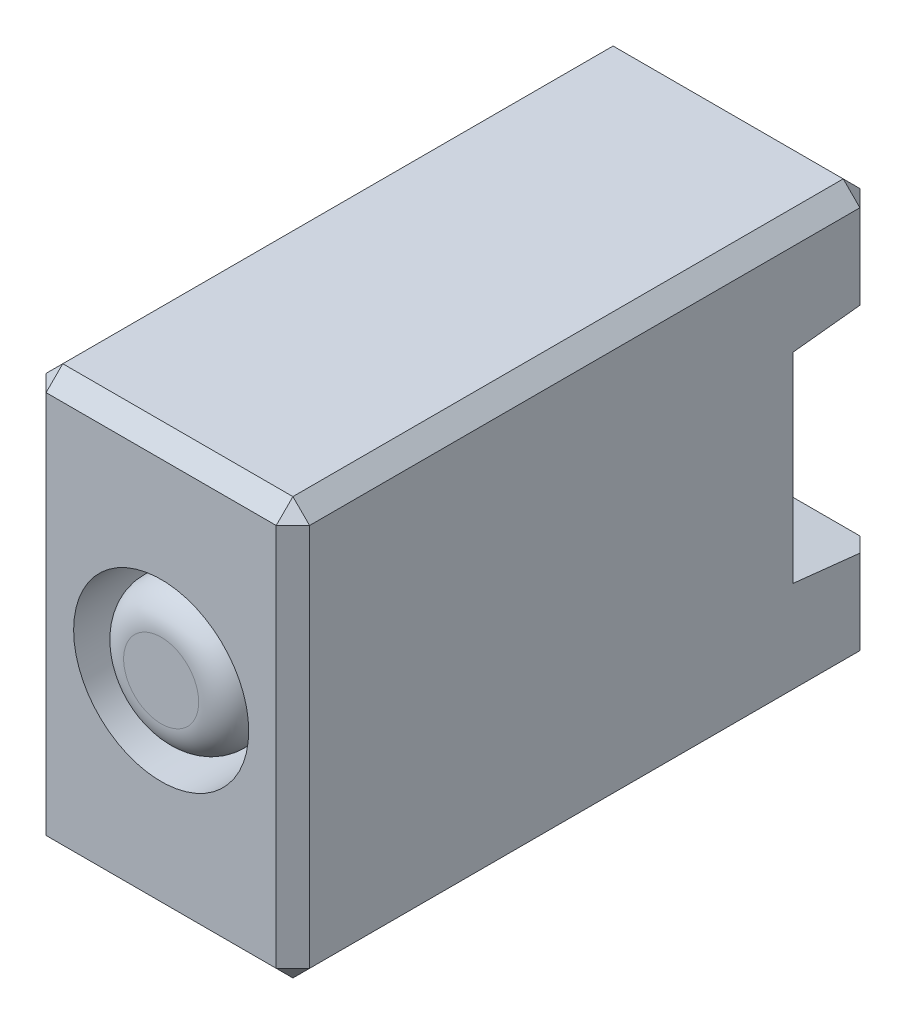
ISO-10303-21;
HEADER;
FILE_DESCRIPTION(('STEP AP214'),'2;1');
FILE_NAME('part.step','',(''),(''),'','','');
FILE_SCHEMA(('AUTOMOTIVE_DESIGN { 1 0 10303 214 1 1 1 1 }'));
ENDSEC;
DATA;
#1=APPLICATION_CONTEXT('core data for automotive mechanical design processes');
#2=APPLICATION_PROTOCOL_DEFINITION('international standard','automotive_design',2000,#1);
#3=PRODUCT_CONTEXT('',#1,'mechanical');
#4=PRODUCT('Part','Part','',(#3));
#5=PRODUCT_RELATED_PRODUCT_CATEGORY('part','',(#4));
#6=PRODUCT_DEFINITION_FORMATION('','',#4);
#7=PRODUCT_DEFINITION_CONTEXT('part definition',#1,'design');
#8=PRODUCT_DEFINITION('design','',#6,#7);
#9=PRODUCT_DEFINITION_SHAPE('','',#8);
#10=(LENGTH_UNIT() NAMED_UNIT(*) SI_UNIT(.MILLI.,.METRE.));
#11=(NAMED_UNIT(*) PLANE_ANGLE_UNIT() SI_UNIT($,.RADIAN.));
#12=(NAMED_UNIT(*) SI_UNIT($,.STERADIAN.) SOLID_ANGLE_UNIT());
#13=UNCERTAINTY_MEASURE_WITH_UNIT(LENGTH_MEASURE(1.E-05),#10,'distance_accuracy_value','');
#14=(GEOMETRIC_REPRESENTATION_CONTEXT(3) GLOBAL_UNCERTAINTY_ASSIGNED_CONTEXT((#13)) GLOBAL_UNIT_ASSIGNED_CONTEXT((#10,
#11,#12)) REPRESENTATION_CONTEXT('',''));
#15=CARTESIAN_POINT('',(0.,0.,0.));
#16=DIRECTION('',(0.,0.,1.));
#17=DIRECTION('',(1.,0.,0.));
#18=AXIS2_PLACEMENT_3D('',#15,#16,#17);
#19=CARTESIAN_POINT('',(7.9,12.5,35.));
#20=DIRECTION('',(-1.,0.,0.));
#21=DIRECTION('',(0.,-1.,0.));
#22=AXIS2_PLACEMENT_3D('',#19,#20,#21);
#23=PLANE('',#22);
#24=DIRECTION('',(0.,-0.107088709712631,0.994249469827409));
#25=VECTOR('',#24,1.);
#26=CARTESIAN_POINT('',(7.9,6.77001120157258,-2.10907498741003));
#27=LINE('',#26,#25);
#28=CARTESIAN_POINT('',(7.9,6.43513867822152,1.00000000000001));
#29=VERTEX_POINT('',#28);
#30=CARTESIAN_POINT('',(7.9,6.00430632492403,5.));
#31=VERTEX_POINT('',#30);
#32=EDGE_CURVE('E161',#29,#31,#27,.T.);
#33=ORIENTED_EDGE('',*,*,#32,.F.);
#34=DIRECTION('',(0.,1.,0.));
#35=VECTOR('',#34,1.);
#36=CARTESIAN_POINT('',(7.9,12.5,1.));
#37=LINE('',#36,#35);
#38=CARTESIAN_POINT('',(7.9,11.5,1.));
#39=VERTEX_POINT('',#38);
#40=EDGE_CURVE('E225',#29,#39,#37,.T.);
#41=ORIENTED_EDGE('',*,*,#40,.T.);
#42=DIRECTION('',(0.,0.,1.));
#43=VECTOR('',#42,1.);
#44=CARTESIAN_POINT('',(7.9,11.5,35.));
#45=LINE('',#44,#43);
#46=CARTESIAN_POINT('',(7.9,11.5,34.));
#47=VERTEX_POINT('',#46);
#48=EDGE_CURVE('E221',#39,#47,#45,.T.);
#49=ORIENTED_EDGE('',*,*,#48,.T.);
#50=DIRECTION('',(0.,-1.,0.));
#51=VECTOR('',#50,1.);
#52=CARTESIAN_POINT('',(7.9,-12.5,34.));
#53=LINE('',#52,#51);
#54=CARTESIAN_POINT('',(7.9,-11.5,34.));
#55=VERTEX_POINT('',#54);
#56=EDGE_CURVE('E219',#47,#55,#53,.T.);
#57=ORIENTED_EDGE('',*,*,#56,.T.);
#58=DIRECTION('',(0.,0.,-1.));
#59=VECTOR('',#58,1.);
#60=CARTESIAN_POINT('',(7.9,-11.5,35.));
#61=LINE('',#60,#59);
#62=CARTESIAN_POINT('',(7.9,-11.5,1.));
#63=VERTEX_POINT('',#62);
#64=EDGE_CURVE('E217',#55,#63,#61,.T.);
#65=ORIENTED_EDGE('',*,*,#64,.T.);
#66=DIRECTION('',(0.,1.,0.));
#67=VECTOR('',#66,1.);
#68=CARTESIAN_POINT('',(7.9,12.5,1.));
#69=LINE('',#68,#67);
#70=CARTESIAN_POINT('',(7.9,-6.43513867822152,0.999999999999997));
#71=VERTEX_POINT('',#70);
#72=EDGE_CURVE('E223',#63,#71,#69,.T.);
#73=ORIENTED_EDGE('',*,*,#72,.T.);
#74=DIRECTION('',(0.,0.107088709712631,0.994249469827409));
#75=VECTOR('',#74,1.);
#76=CARTESIAN_POINT('',(7.9,-6.77001120157258,-2.10907498741003));
#77=LINE('',#76,#75);
#78=CARTESIAN_POINT('',(7.9,-6.00430632492403,5.));
#79=VERTEX_POINT('',#78);
#80=EDGE_CURVE('E186',#71,#79,#77,.T.);
#81=ORIENTED_EDGE('',*,*,#80,.T.);
#82=DIRECTION('',(0.,-1.,0.));
#83=VECTOR('',#82,1.);
#84=CARTESIAN_POINT('',(7.9,6.00430632492403,5.));
#85=LINE('',#84,#83);
#86=EDGE_CURVE('E174',#31,#79,#85,.T.);
#87=ORIENTED_EDGE('',*,*,#86,.F.);
#88=EDGE_LOOP('',(#33,#41,#49,#57,#65,#73,#81,#87));
#89=FACE_BOUND('',#88,.T.);
#90=ADVANCED_FACE('F33',(#89),#23,.F.);
#91=CARTESIAN_POINT('',(-7.9,12.5,35.));
#92=DIRECTION('',(1.,0.,0.));
#93=DIRECTION('',(0.,1.,0.));
#94=AXIS2_PLACEMENT_3D('',#91,#92,#93);
#95=PLANE('',#94);
#96=DIRECTION('',(0.,0.,-1.));
#97=VECTOR('',#96,1.);
#98=CARTESIAN_POINT('',(-7.9,11.5,35.));
#99=LINE('',#98,#97);
#100=CARTESIAN_POINT('',(-7.9,11.5,34.));
#101=VERTEX_POINT('',#100);
#102=CARTESIAN_POINT('',(-7.9,11.5,1.));
#103=VERTEX_POINT('',#102);
#104=EDGE_CURVE('E242',#101,#103,#99,.T.);
#105=ORIENTED_EDGE('',*,*,#104,.T.);
#106=DIRECTION('',(0.,-1.,0.));
#107=VECTOR('',#106,1.);
#108=CARTESIAN_POINT('',(-7.9,12.5,1.));
#109=LINE('',#108,#107);
#110=CARTESIAN_POINT('',(-7.9,6.43513867822152,1.));
#111=VERTEX_POINT('',#110);
#112=EDGE_CURVE('E244',#103,#111,#109,.T.);
#113=ORIENTED_EDGE('',*,*,#112,.T.);
#114=DIRECTION('',(0.,-0.107088709712631,0.994249469827409));
#115=VECTOR('',#114,1.);
#116=CARTESIAN_POINT('',(-7.9,6.77001120157258,-2.10907498741003));
#117=LINE('',#116,#115);
#118=CARTESIAN_POINT('',(-7.9,6.00430632492403,5.));
#119=VERTEX_POINT('',#118);
#120=EDGE_CURVE('E189',#111,#119,#117,.T.);
#121=ORIENTED_EDGE('',*,*,#120,.T.);
#122=DIRECTION('',(0.,-1.,0.));
#123=VECTOR('',#122,1.);
#124=CARTESIAN_POINT('',(-7.9,6.00430632492403,5.));
#125=LINE('',#124,#123);
#126=CARTESIAN_POINT('',(-7.9,-6.00430632492403,5.));
#127=VERTEX_POINT('',#126);
#128=EDGE_CURVE('E181',#119,#127,#125,.T.);
#129=ORIENTED_EDGE('',*,*,#128,.T.);
#130=DIRECTION('',(0.,0.107088709712631,0.994249469827409));
#131=VECTOR('',#130,1.);
#132=CARTESIAN_POINT('',(-7.9,-6.77001120157258,-2.10907498741003));
#133=LINE('',#132,#131);
#134=CARTESIAN_POINT('',(-7.9,-6.43513867822152,1.));
#135=VERTEX_POINT('',#134);
#136=EDGE_CURVE('E183',#135,#127,#133,.T.);
#137=ORIENTED_EDGE('',*,*,#136,.F.);
#138=DIRECTION('',(0.,-1.,0.));
#139=VECTOR('',#138,1.);
#140=CARTESIAN_POINT('',(-7.9,12.5,1.));
#141=LINE('',#140,#139);
#142=CARTESIAN_POINT('',(-7.9,-11.5,1.));
#143=VERTEX_POINT('',#142);
#144=EDGE_CURVE('E240',#135,#143,#141,.T.);
#145=ORIENTED_EDGE('',*,*,#144,.T.);
#146=DIRECTION('',(0.,0.,1.));
#147=VECTOR('',#146,1.);
#148=CARTESIAN_POINT('',(-7.9,-11.5,35.));
#149=LINE('',#148,#147);
#150=CARTESIAN_POINT('',(-7.9,-11.5,34.));
#151=VERTEX_POINT('',#150);
#152=EDGE_CURVE('E236',#143,#151,#149,.T.);
#153=ORIENTED_EDGE('',*,*,#152,.T.);
#154=DIRECTION('',(0.,1.,0.));
#155=VECTOR('',#154,1.);
#156=CARTESIAN_POINT('',(-7.9,12.5,34.));
#157=LINE('',#156,#155);
#158=EDGE_CURVE('E238',#151,#101,#157,.T.);
#159=ORIENTED_EDGE('',*,*,#158,.T.);
#160=EDGE_LOOP('',(#105,#113,#121,#129,#137,#145,#153,#159));
#161=FACE_BOUND('',#160,.T.);
#162=ADVANCED_FACE('F382',(#161),#95,.F.);
#163=CARTESIAN_POINT('',(0.,0.,0.));
#164=DIRECTION('',(0.,0.,1.));
#165=DIRECTION('',(1.,0.,0.));
#166=AXIS2_PLACEMENT_3D('',#163,#164,#165);
#167=PLANE('',#166);
#168=DIRECTION('',(-1.,0.,0.));
#169=VECTOR('',#168,1.);
#170=CARTESIAN_POINT('',(0.,-6.5428467665459,0.));
#171=LINE('',#170,#169);
#172=CARTESIAN_POINT('',(6.89999999999999,-6.5428467665459,0.));
#173=VERTEX_POINT('',#172);
#174=CARTESIAN_POINT('',(-6.89999999999999,-6.5428467665459,0.));
#175=VERTEX_POINT('',#174);
#176=EDGE_CURVE('E208',#173,#175,#171,.T.);
#177=ORIENTED_EDGE('',*,*,#176,.F.);
#178=DIRECTION('',(0.,-1.,0.));
#179=VECTOR('',#178,1.);
#180=CARTESIAN_POINT('',(6.89999999999999,0.,0.));
#181=LINE('',#180,#179);
#182=CARTESIAN_POINT('',(6.9,-11.5,0.));
#183=VERTEX_POINT('',#182);
#184=EDGE_CURVE('E254',#173,#183,#181,.T.);
#185=ORIENTED_EDGE('',*,*,#184,.T.);
#186=DIRECTION('',(-1.,0.,0.));
#187=VECTOR('',#186,1.);
#188=CARTESIAN_POINT('',(0.,-11.5,0.));
#189=LINE('',#188,#187);
#190=CARTESIAN_POINT('',(-6.89999999999999,-11.5,0.));
#191=VERTEX_POINT('',#190);
#192=EDGE_CURVE('E250',#183,#191,#189,.T.);
#193=ORIENTED_EDGE('',*,*,#192,.T.);
#194=DIRECTION('',(0.,1.,0.));
#195=VECTOR('',#194,1.);
#196=CARTESIAN_POINT('',(-6.89999999999999,0.,0.));
#197=LINE('',#196,#195);
#198=EDGE_CURVE('E252',#191,#175,#197,.T.);
#199=ORIENTED_EDGE('',*,*,#198,.T.);
#200=EDGE_LOOP('',(#177,#185,#193,#199));
#201=FACE_BOUND('',#200,.T.);
#202=ADVANCED_FACE('F357',(#201),#167,.F.);
#203=CARTESIAN_POINT('',(-7.9,12.5,35.));
#204=DIRECTION('',(0.,-1.,0.));
#205=DIRECTION('',(0.,0.,-1.));
#206=AXIS2_PLACEMENT_3D('',#203,#204,#205);
#207=PLANE('',#206);
#208=DIRECTION('',(1.,0.,0.));
#209=VECTOR('',#208,1.);
#210=CARTESIAN_POINT('',(7.9,12.5,34.));
#211=LINE('',#210,#209);
#212=CARTESIAN_POINT('',(-6.9,12.5,34.));
#213=VERTEX_POINT('',#212);
#214=CARTESIAN_POINT('',(6.9,12.5,34.));
#215=VERTEX_POINT('',#214);
#216=EDGE_CURVE('E265',#213,#215,#211,.T.);
#217=ORIENTED_EDGE('',*,*,#216,.T.);
#218=DIRECTION('',(0.,0.,-1.));
#219=VECTOR('',#218,1.);
#220=CARTESIAN_POINT('',(6.9,12.5,35.));
#221=LINE('',#220,#219);
#222=CARTESIAN_POINT('',(6.9,12.5,1.));
#223=VERTEX_POINT('',#222);
#224=EDGE_CURVE('E271',#215,#223,#221,.T.);
#225=ORIENTED_EDGE('',*,*,#224,.T.);
#226=DIRECTION('',(-1.,0.,0.));
#227=VECTOR('',#226,1.);
#228=CARTESIAN_POINT('',(-7.9,12.5,1.));
#229=LINE('',#228,#227);
#230=CARTESIAN_POINT('',(-6.9,12.5,1.));
#231=VERTEX_POINT('',#230);
#232=EDGE_CURVE('E269',#223,#231,#229,.T.);
#233=ORIENTED_EDGE('',*,*,#232,.T.);
#234=DIRECTION('',(0.,0.,1.));
#235=VECTOR('',#234,1.);
#236=CARTESIAN_POINT('',(-6.9,12.5,35.));
#237=LINE('',#236,#235);
#238=EDGE_CURVE('E267',#231,#213,#237,.T.);
#239=ORIENTED_EDGE('',*,*,#238,.T.);
#240=EDGE_LOOP('',(#217,#225,#233,#239));
#241=FACE_BOUND('',#240,.T.);
#242=ADVANCED_FACE('F417',(#241),#207,.F.);
#243=CARTESIAN_POINT('',(-7.9,-12.5,35.));
#244=DIRECTION('',(0.,1.,0.));
#245=DIRECTION('',(0.,0.,1.));
#246=AXIS2_PLACEMENT_3D('',#243,#244,#245);
#247=PLANE('',#246);
#248=DIRECTION('',(1.,0.,0.));
#249=VECTOR('',#248,1.);
#250=CARTESIAN_POINT('',(-7.9,-12.5,1.));
#251=LINE('',#250,#249);
#252=CARTESIAN_POINT('',(-6.9,-12.5,1.));
#253=VERTEX_POINT('',#252);
#254=CARTESIAN_POINT('',(6.9,-12.5,1.));
#255=VERTEX_POINT('',#254);
#256=EDGE_CURVE('E274',#253,#255,#251,.T.);
#257=ORIENTED_EDGE('',*,*,#256,.T.);
#258=DIRECTION('',(0.,0.,1.));
#259=VECTOR('',#258,1.);
#260=CARTESIAN_POINT('',(6.9,-12.5,35.));
#261=LINE('',#260,#259);
#262=CARTESIAN_POINT('',(6.9,-12.5,34.));
#263=VERTEX_POINT('',#262);
#264=EDGE_CURVE('E11',#255,#263,#261,.T.);
#265=ORIENTED_EDGE('',*,*,#264,.T.);
#266=DIRECTION('',(-1.,0.,0.));
#267=VECTOR('',#266,1.);
#268=CARTESIAN_POINT('',(-7.9,-12.5,34.));
#269=LINE('',#268,#267);
#270=CARTESIAN_POINT('',(-6.9,-12.5,34.));
#271=VERTEX_POINT('',#270);
#272=EDGE_CURVE('E42',#263,#271,#269,.T.);
#273=ORIENTED_EDGE('',*,*,#272,.T.);
#274=DIRECTION('',(0.,0.,-1.));
#275=VECTOR('',#274,1.);
#276=CARTESIAN_POINT('',(-6.9,-12.5,35.));
#277=LINE('',#276,#275);
#278=EDGE_CURVE('E276',#271,#253,#277,.T.);
#279=ORIENTED_EDGE('',*,*,#278,.T.);
#280=EDGE_LOOP('',(#257,#265,#273,#279));
#281=FACE_BOUND('',#280,.T.);
#282=ADVANCED_FACE('F376',(#281),#247,.F.);
#283=CARTESIAN_POINT('',(0.,0.,35.));
#284=DIRECTION('',(0.,0.,1.));
#285=DIRECTION('',(1.,0.,0.));
#286=AXIS2_PLACEMENT_3D('',#283,#284,#285);
#287=PLANE('',#286);
#288=DIRECTION('',(-1.,0.,0.));
#289=VECTOR('',#288,1.);
#290=CARTESIAN_POINT('',(-7.9,11.5,35.));
#291=LINE('',#290,#289);
#292=CARTESIAN_POINT('',(6.9,11.5,35.));
#293=VERTEX_POINT('',#292);
#294=CARTESIAN_POINT('',(-6.9,11.5,35.));
#295=VERTEX_POINT('',#294);
#296=EDGE_CURVE('E260',#293,#295,#291,.T.);
#297=ORIENTED_EDGE('',*,*,#296,.T.);
#298=DIRECTION('',(0.,-1.,0.));
#299=VECTOR('',#298,1.);
#300=CARTESIAN_POINT('',(-6.9,-12.5,35.));
#301=LINE('',#300,#299);
#302=CARTESIAN_POINT('',(-6.9,-11.5,35.));
#303=VERTEX_POINT('',#302);
#304=EDGE_CURVE('E262',#295,#303,#301,.T.);
#305=ORIENTED_EDGE('',*,*,#304,.T.);
#306=DIRECTION('',(1.,0.,0.));
#307=VECTOR('',#306,1.);
#308=CARTESIAN_POINT('',(7.9,-11.5,35.));
#309=LINE('',#308,#307);
#310=CARTESIAN_POINT('',(6.9,-11.5,35.));
#311=VERTEX_POINT('',#310);
#312=EDGE_CURVE('E256',#303,#311,#309,.T.);
#313=ORIENTED_EDGE('',*,*,#312,.T.);
#314=DIRECTION('',(0.,1.,0.));
#315=VECTOR('',#314,1.);
#316=CARTESIAN_POINT('',(6.9,12.5,35.));
#317=LINE('',#316,#315);
#318=EDGE_CURVE('E258',#311,#293,#317,.T.);
#319=ORIENTED_EDGE('',*,*,#318,.T.);
#320=EDGE_LOOP('',(#297,#305,#313,#319));
#321=FACE_BOUND('',#320,.T.);
#322=CARTESIAN_POINT('',(0.,0.,35.));
#323=DIRECTION('',(0.,0.,1.));
#324=DIRECTION('',(1.,0.,0.));
#325=AXIS2_PLACEMENT_3D('',#322,#323,#324);
#326=CIRCLE('',#325,5.25);
#327=CARTESIAN_POINT('',(5.25,0.,35.));
#328=VERTEX_POINT('',#327);
#329=EDGE_CURVE('E199',#328,#328,#326,.T.);
#330=ORIENTED_EDGE('',*,*,#329,.F.);
#331=EDGE_LOOP('',(#330));
#332=FACE_BOUND('',#331,.T.);
#333=ADVANCED_FACE('F426',(#321,#332),#287,.T.);
#334=DIRECTION('',(1.,0.,0.));
#335=VECTOR('',#334,1.);
#336=CARTESIAN_POINT('',(0.,11.5,0.));
#337=LINE('',#336,#335);
#338=CARTESIAN_POINT('',(-6.9,11.5,0.));
#339=VERTEX_POINT('',#338);
#340=CARTESIAN_POINT('',(6.89999999999999,11.5,0.));
#341=VERTEX_POINT('',#340);
#342=EDGE_CURVE('E227',#339,#341,#337,.T.);
#343=ORIENTED_EDGE('',*,*,#342,.T.);
#344=DIRECTION('',(0.,-1.,0.));
#345=VECTOR('',#344,1.);
#346=CARTESIAN_POINT('',(6.89999999999999,0.,0.));
#347=LINE('',#346,#345);
#348=CARTESIAN_POINT('',(6.89999999999999,6.5428467665459,0.));
#349=VERTEX_POINT('',#348);
#350=EDGE_CURVE('E231',#341,#349,#347,.T.);
#351=ORIENTED_EDGE('',*,*,#350,.T.);
#352=DIRECTION('',(-1.,0.,0.));
#353=VECTOR('',#352,1.);
#354=CARTESIAN_POINT('',(0.,6.5428467665459,0.));
#355=LINE('',#354,#353);
#356=CARTESIAN_POINT('',(-6.89999999999999,6.5428467665459,0.));
#357=VERTEX_POINT('',#356);
#358=EDGE_CURVE('E203',#349,#357,#355,.T.);
#359=ORIENTED_EDGE('',*,*,#358,.T.);
#360=DIRECTION('',(0.,1.,0.));
#361=VECTOR('',#360,1.);
#362=CARTESIAN_POINT('',(-6.89999999999999,0.,0.));
#363=LINE('',#362,#361);
#364=EDGE_CURVE('E229',#357,#339,#363,.T.);
#365=ORIENTED_EDGE('',*,*,#364,.T.);
#366=EDGE_LOOP('',(#343,#351,#359,#365));
#367=FACE_BOUND('',#366,.T.);
#368=ADVANCED_FACE('F394',(#367),#167,.F.);
#369=CARTESIAN_POINT('',(0.,0.,25.));
#370=DIRECTION('',(0.,0.,1.));
#371=DIRECTION('',(1.,0.,0.));
#372=AXIS2_PLACEMENT_3D('',#369,#370,#371);
#373=CYLINDRICAL_SURFACE('',#372,5.25);
#374=CARTESIAN_POINT('',(0.,0.,25.));
#375=DIRECTION('',(0.,0.,1.));
#376=DIRECTION('',(1.,0.,0.));
#377=AXIS2_PLACEMENT_3D('',#374,#375,#376);
#378=CIRCLE('',#377,5.25);
#379=CARTESIAN_POINT('',(5.25,0.,25.));
#380=VERTEX_POINT('',#379);
#381=EDGE_CURVE('E200',#380,#380,#378,.T.);
#382=ORIENTED_EDGE('',*,*,#381,.F.);
#383=EDGE_LOOP('',(#382));
#384=FACE_BOUND('',#383,.T.);
#385=ORIENTED_EDGE('',*,*,#329,.T.);
#386=EDGE_LOOP('',(#385));
#387=FACE_BOUND('',#386,.T.);
#388=ADVANCED_FACE('F489',(#384,#387),#373,.F.);
#389=CARTESIAN_POINT('',(0.,0.,25.));
#390=DIRECTION('',(0.,0.,1.));
#391=DIRECTION('',(1.,0.,0.));
#392=AXIS2_PLACEMENT_3D('',#389,#390,#391);
#393=PLANE('',#392);
#394=CARTESIAN_POINT('',(0.,0.,25.));
#395=DIRECTION('',(0.,0.,1.));
#396=DIRECTION('',(1.,0.,0.));
#397=AXIS2_PLACEMENT_3D('',#394,#395,#396);
#398=CIRCLE('',#397,4.25);
#399=CARTESIAN_POINT('',(4.25,0.,25.));
#400=VERTEX_POINT('',#399);
#401=EDGE_CURVE('E195',#400,#400,#398,.T.);
#402=ORIENTED_EDGE('',*,*,#401,.F.);
#403=EDGE_LOOP('',(#402));
#404=FACE_BOUND('',#403,.T.);
#405=ORIENTED_EDGE('',*,*,#381,.T.);
#406=EDGE_LOOP('',(#405));
#407=FACE_BOUND('',#406,.T.);
#408=ADVANCED_FACE('F479',(#404,#407),#393,.T.);
#409=CARTESIAN_POINT('',(0.,0.,25.));
#410=DIRECTION('',(0.,0.,1.));
#411=DIRECTION('',(1.,0.,0.));
#412=AXIS2_PLACEMENT_3D('',#409,#410,#411);
#413=CYLINDRICAL_SURFACE('',#412,4.25);
#414=CARTESIAN_POINT('',(0.,0.,33.));
#415=DIRECTION('',(0.,0.,1.));
#416=DIRECTION('',(1.,0.,0.));
#417=AXIS2_PLACEMENT_3D('',#414,#415,#416);
#418=CIRCLE('',#417,4.25);
#419=CARTESIAN_POINT('',(4.25,0.,33.));
#420=VERTEX_POINT('',#419);
#421=EDGE_CURVE('E214',#420,#420,#418,.F.);
#422=ORIENTED_EDGE('',*,*,#421,.T.);
#423=EDGE_LOOP('',(#422));
#424=FACE_BOUND('',#423,.T.);
#425=ORIENTED_EDGE('',*,*,#401,.T.);
#426=EDGE_LOOP('',(#425));
#427=FACE_BOUND('',#426,.T.);
#428=ADVANCED_FACE('F472',(#424,#427),#413,.T.);
#429=CARTESIAN_POINT('',(0.,0.,35.));
#430=DIRECTION('',(0.,0.,1.));
#431=DIRECTION('',(1.,0.,0.));
#432=AXIS2_PLACEMENT_3D('',#429,#430,#431);
#433=CIRCLE('',#432,2.25);
#434=CARTESIAN_POINT('',(2.25,0.,35.));
#435=VERTEX_POINT('',#434);
#436=EDGE_CURVE('E211',#435,#435,#433,.T.);
#437=ORIENTED_EDGE('',*,*,#436,.T.);
#438=EDGE_LOOP('',(#437));
#439=FACE_BOUND('',#438,.T.);
#440=ADVANCED_FACE('F470',(#439),#287,.T.);
#441=CARTESIAN_POINT('',(-7.9,-6.77001120157258,-2.10907498741003));
#442=DIRECTION('',(0.,0.994249469827409,-0.107088709712631));
#443=DIRECTION('',(0.,0.107088709712631,0.994249469827409));
#444=AXIS2_PLACEMENT_3D('',#441,#442,#443);
#445=PLANE('',#444);
#446=ORIENTED_EDGE('',*,*,#80,.F.);
#447=DIRECTION('',(0.705064867868107,0.0759411890627497,0.705064867868102));
#448=VECTOR('',#447,1.);
#449=CARTESIAN_POINT('',(-1.51794280407628,-7.44952729359686,-8.41794280407622));
#450=LINE('',#449,#448);
#451=EDGE_CURVE('E248',#71,#173,#450,.F.);
#452=ORIENTED_EDGE('',*,*,#451,.T.);
#453=ORIENTED_EDGE('',*,*,#176,.T.);
#454=DIRECTION('',(0.705064867868107,-0.0759411890627497,-0.705064867868102));
#455=VECTOR('',#454,1.);
#456=CARTESIAN_POINT('',(-6.33649738877329,-6.60354055556692,-0.5635026112267));
#457=LINE('',#456,#455);
#458=EDGE_CURVE('E246',#175,#135,#457,.F.);
#459=ORIENTED_EDGE('',*,*,#458,.T.);
#460=ORIENTED_EDGE('',*,*,#136,.T.);
#461=DIRECTION('',(1.,0.,0.));
#462=VECTOR('',#461,1.);
#463=CARTESIAN_POINT('',(-7.9,-6.00430632492403,5.));
#464=LINE('',#463,#462);
#465=EDGE_CURVE('E182',#127,#79,#464,.T.);
#466=ORIENTED_EDGE('',*,*,#465,.T.);
#467=EDGE_LOOP('',(#446,#452,#453,#459,#460,#466));
#468=FACE_BOUND('',#467,.T.);
#469=ADVANCED_FACE('F360',(#468),#445,.T.);
#470=CARTESIAN_POINT('',(-7.9,6.77001120157258,-2.10907498741003));
#471=DIRECTION('',(0.,0.994249469827409,0.107088709712631));
#472=DIRECTION('',(0.,-0.107088709712631,0.994249469827409));
#473=AXIS2_PLACEMENT_3D('',#470,#471,#472);
#474=PLANE('',#473);
#475=ORIENTED_EDGE('',*,*,#358,.F.);
#476=DIRECTION('',(-0.705064867868107,0.0759411890627499,-0.705064867868102));
#477=VECTOR('',#476,1.);
#478=CARTESIAN_POINT('',(7.57526631353067,6.47011512280566,0.675266313530678));
#479=LINE('',#478,#477);
#480=EDGE_CURVE('E169',#349,#29,#479,.F.);
#481=ORIENTED_EDGE('',*,*,#480,.T.);
#482=ORIENTED_EDGE('',*,*,#32,.T.);
#483=DIRECTION('',(1.,0.,0.));
#484=VECTOR('',#483,1.);
#485=CARTESIAN_POINT('',(-7.9,6.00430632492403,5.));
#486=LINE('',#485,#484);
#487=EDGE_CURVE('E166',#119,#31,#486,.T.);
#488=ORIENTED_EDGE('',*,*,#487,.F.);
#489=ORIENTED_EDGE('',*,*,#120,.F.);
#490=DIRECTION('',(-0.705064867868107,-0.0759411890627499,0.705064867868102));
#491=VECTOR('',#490,1.);
#492=CARTESIAN_POINT('',(-7.57526631353068,6.47011512280566,0.675266313530679));
#493=LINE('',#492,#491);
#494=EDGE_CURVE('E233',#111,#357,#493,.F.);
#495=ORIENTED_EDGE('',*,*,#494,.T.);
#496=EDGE_LOOP('',(#475,#481,#482,#488,#489,#495));
#497=FACE_BOUND('',#496,.T.);
#498=ADVANCED_FACE('F164',(#497),#474,.F.);
#499=CARTESIAN_POINT('',(-7.9,6.00430632492403,5.));
#500=DIRECTION('',(0.,0.,1.));
#501=DIRECTION('',(0.,-1.,0.));
#502=AXIS2_PLACEMENT_3D('',#499,#500,#501);
#503=PLANE('',#502);
#504=ORIENTED_EDGE('',*,*,#465,.F.);
#505=ORIENTED_EDGE('',*,*,#128,.F.);
#506=ORIENTED_EDGE('',*,*,#487,.T.);
#507=ORIENTED_EDGE('',*,*,#86,.T.);
#508=EDGE_LOOP('',(#504,#505,#506,#507));
#509=FACE_BOUND('',#508,.T.);
#510=ADVANCED_FACE('F179',(#509),#503,.F.);
#511=CARTESIAN_POINT('',(0.,0.,33.));
#512=DIRECTION('',(0.,0.,1.));
#513=DIRECTION('',(1.,0.,0.));
#514=AXIS2_PLACEMENT_3D('',#511,#512,#513);
#515=TOROIDAL_SURFACE('',#514,2.25,2.);
#516=ORIENTED_EDGE('',*,*,#421,.F.);
#517=EDGE_LOOP('',(#516));
#518=FACE_BOUND('',#517,.T.);
#519=ORIENTED_EDGE('',*,*,#436,.F.);
#520=EDGE_LOOP('',(#519));
#521=FACE_BOUND('',#520,.T.);
#522=ADVANCED_FACE('F458',(#518,#521),#515,.T.);
#523=CARTESIAN_POINT('',(-7.9,12.5,1.));
#524=DIRECTION('',(0.707106781186545,0.,0.70710678118655));
#525=DIRECTION('',(0.,-1.,0.));
#526=AXIS2_PLACEMENT_3D('',#523,#524,#525);
#527=PLANE('',#526);
#528=DIRECTION('',(-0.70710678118655,0.,0.707106781186545));
#529=VECTOR('',#528,1.);
#530=CARTESIAN_POINT('',(-7.9,-11.5,1.));
#531=LINE('',#530,#529);
#532=EDGE_CURVE('E37',#143,#191,#531,.F.);
#533=ORIENTED_EDGE('',*,*,#532,.F.);
#534=ORIENTED_EDGE('',*,*,#144,.F.);
#535=ORIENTED_EDGE('',*,*,#458,.F.);
#536=ORIENTED_EDGE('',*,*,#198,.F.);
#537=EDGE_LOOP('',(#533,#534,#535,#536));
#538=FACE_BOUND('',#537,.T.);
#539=ADVANCED_FACE('F35',(#538),#527,.F.);
#540=CARTESIAN_POINT('',(-7.9,-11.5,1.));
#541=DIRECTION('',(-0.577350269189626,-0.577350269189622,-0.57735026918963));
#542=DIRECTION('',(-0.70710678118655,0.,0.707106781186545));
#543=AXIS2_PLACEMENT_3D('',#540,#541,#542);
#544=PLANE('',#543);
#545=DIRECTION('',(0.707106781186545,-0.70710678118655,0.));
#546=VECTOR('',#545,1.);
#547=CARTESIAN_POINT('',(-7.9,-11.5,1.));
#548=LINE('',#547,#546);
#549=EDGE_CURVE('E337',#143,#253,#548,.T.);
#550=ORIENTED_EDGE('',*,*,#549,.F.);
#551=ORIENTED_EDGE('',*,*,#532,.T.);
#552=DIRECTION('',(0.,0.70710678118655,-0.707106781186545));
#553=VECTOR('',#552,1.);
#554=CARTESIAN_POINT('',(-6.9,-12.,0.5));
#555=LINE('',#554,#553);
#556=EDGE_CURVE('E339',#253,#191,#555,.T.);
#557=ORIENTED_EDGE('',*,*,#556,.F.);
#558=EDGE_LOOP('',(#550,#551,#557));
#559=FACE_BOUND('',#558,.T.);
#560=ADVANCED_FACE('F349',(#559),#544,.T.);
#561=CARTESIAN_POINT('',(7.9,12.5,1.));
#562=DIRECTION('',(-0.707106781186545,0.,0.70710678118655));
#563=DIRECTION('',(0.,1.,0.));
#564=AXIS2_PLACEMENT_3D('',#561,#562,#563);
#565=PLANE('',#564);
#566=ORIENTED_EDGE('',*,*,#451,.F.);
#567=ORIENTED_EDGE('',*,*,#72,.F.);
#568=DIRECTION('',(-0.70710678118655,0.,-0.707106781186545));
#569=VECTOR('',#568,1.);
#570=CARTESIAN_POINT('',(6.9,-11.5,0.));
#571=LINE('',#570,#569);
#572=EDGE_CURVE('E334',#183,#63,#571,.F.);
#573=ORIENTED_EDGE('',*,*,#572,.F.);
#574=ORIENTED_EDGE('',*,*,#184,.F.);
#575=EDGE_LOOP('',(#566,#567,#573,#574));
#576=FACE_BOUND('',#575,.T.);
#577=ADVANCED_FACE('F365',(#576),#565,.F.);
#578=CARTESIAN_POINT('',(-7.9,-12.5,1.));
#579=DIRECTION('',(0.,0.707106781186545,0.70710678118655));
#580=DIRECTION('',(1.,0.,0.));
#581=AXIS2_PLACEMENT_3D('',#578,#579,#580);
#582=PLANE('',#581);
#583=ORIENTED_EDGE('',*,*,#556,.T.);
#584=ORIENTED_EDGE('',*,*,#192,.F.);
#585=DIRECTION('',(0.,-0.70710678118655,0.707106781186545));
#586=VECTOR('',#585,1.);
#587=CARTESIAN_POINT('',(6.9,-11.5,0.));
#588=LINE('',#587,#586);
#589=EDGE_CURVE('E331',#255,#183,#588,.F.);
#590=ORIENTED_EDGE('',*,*,#589,.F.);
#591=ORIENTED_EDGE('',*,*,#256,.F.);
#592=EDGE_LOOP('',(#583,#584,#590,#591));
#593=FACE_BOUND('',#592,.T.);
#594=ADVANCED_FACE('F368',(#593),#582,.F.);
#595=CARTESIAN_POINT('',(-6.9,-12.5,35.));
#596=DIRECTION('',(0.70710678118655,0.707106781186545,0.));
#597=DIRECTION('',(0.,0.,-1.));
#598=AXIS2_PLACEMENT_3D('',#595,#596,#597);
#599=PLANE('',#598);
#600=ORIENTED_EDGE('',*,*,#549,.T.);
#601=ORIENTED_EDGE('',*,*,#278,.F.);
#602=DIRECTION('',(-0.707106781186545,0.70710678118655,0.));
#603=VECTOR('',#602,1.);
#604=CARTESIAN_POINT('',(-7.4,-12.,34.));
#605=LINE('',#604,#603);
#606=EDGE_CURVE('E328',#151,#271,#605,.F.);
#607=ORIENTED_EDGE('',*,*,#606,.F.);
#608=ORIENTED_EDGE('',*,*,#152,.F.);
#609=EDGE_LOOP('',(#600,#601,#607,#608));
#610=FACE_BOUND('',#609,.T.);
#611=ADVANCED_FACE('F379',(#610),#599,.F.);
#612=CARTESIAN_POINT('',(6.9,-11.5,0.));
#613=DIRECTION('',(0.577350269189626,-0.577350269189622,-0.57735026918963));
#614=DIRECTION('',(-0.70710678118655,0.,-0.707106781186545));
#615=AXIS2_PLACEMENT_3D('',#612,#613,#614);
#616=PLANE('',#615);
#617=ORIENTED_EDGE('',*,*,#589,.T.);
#618=ORIENTED_EDGE('',*,*,#572,.T.);
#619=DIRECTION('',(0.707106781186545,0.70710678118655,0.));
#620=VECTOR('',#619,1.);
#621=CARTESIAN_POINT('',(7.4,-12.,1.));
#622=LINE('',#621,#620);
#623=EDGE_CURVE('E325',#255,#63,#622,.T.);
#624=ORIENTED_EDGE('',*,*,#623,.F.);
#625=EDGE_LOOP('',(#617,#618,#624));
#626=FACE_BOUND('',#625,.T.);
#627=ADVANCED_FACE('F372',(#626),#616,.T.);
#628=CARTESIAN_POINT('',(-6.9,-11.5,35.));
#629=DIRECTION('',(-0.57735026918963,-0.577350269189622,0.577350269189626));
#630=DIRECTION('',(0.707106781186545,0.,0.70710678118655));
#631=AXIS2_PLACEMENT_3D('',#628,#629,#630);
#632=PLANE('',#631);
#633=DIRECTION('',(-0.707106781186545,0.,-0.70710678118655));
#634=VECTOR('',#633,1.);
#635=CARTESIAN_POINT('',(-6.9,-11.5,35.));
#636=LINE('',#635,#634);
#637=EDGE_CURVE('E319',#151,#303,#636,.F.);
#638=ORIENTED_EDGE('',*,*,#637,.F.);
#639=ORIENTED_EDGE('',*,*,#606,.T.);
#640=DIRECTION('',(0.,0.70710678118655,0.707106781186545));
#641=VECTOR('',#640,1.);
#642=CARTESIAN_POINT('',(-6.9,-11.5,35.));
#643=LINE('',#642,#641);
#644=EDGE_CURVE('E322',#303,#271,#643,.F.);
#645=ORIENTED_EDGE('',*,*,#644,.F.);
#646=EDGE_LOOP('',(#638,#639,#645));
#647=FACE_BOUND('',#646,.T.);
#648=ADVANCED_FACE('F612',(#647),#632,.T.);
#649=CARTESIAN_POINT('',(7.9,-11.5,35.));
#650=DIRECTION('',(-0.70710678118655,0.707106781186545,0.));
#651=DIRECTION('',(0.,0.,-1.));
#652=AXIS2_PLACEMENT_3D('',#649,#650,#651);
#653=PLANE('',#652);
#654=ORIENTED_EDGE('',*,*,#623,.T.);
#655=ORIENTED_EDGE('',*,*,#64,.F.);
#656=DIRECTION('',(-0.707106781186545,-0.70710678118655,0.));
#657=VECTOR('',#656,1.);
#658=CARTESIAN_POINT('',(7.9,-11.5,34.));
#659=LINE('',#658,#657);
#660=EDGE_CURVE('E317',#263,#55,#659,.F.);
#661=ORIENTED_EDGE('',*,*,#660,.F.);
#662=ORIENTED_EDGE('',*,*,#264,.F.);
#663=EDGE_LOOP('',(#654,#655,#661,#662));
#664=FACE_BOUND('',#663,.T.);
#665=ADVANCED_FACE('F375',(#664),#653,.F.);
#666=CARTESIAN_POINT('',(0.,-11.5,35.));
#667=DIRECTION('',(0.,-0.707106781186545,0.70710678118655));
#668=DIRECTION('',(-1.,0.,0.));
#669=AXIS2_PLACEMENT_3D('',#666,#667,#668);
#670=PLANE('',#669);
#671=ORIENTED_EDGE('',*,*,#644,.T.);
#672=ORIENTED_EDGE('',*,*,#272,.F.);
#673=DIRECTION('',(0.,-0.70710678118655,-0.707106781186545));
#674=VECTOR('',#673,1.);
#675=CARTESIAN_POINT('',(6.9,-12.,34.5));
#676=LINE('',#675,#674);
#677=EDGE_CURVE('E50',#311,#263,#676,.T.);
#678=ORIENTED_EDGE('',*,*,#677,.F.);
#679=ORIENTED_EDGE('',*,*,#312,.F.);
#680=EDGE_LOOP('',(#671,#672,#678,#679));
#681=FACE_BOUND('',#680,.T.);
#682=ADVANCED_FACE('F630',(#681),#670,.T.);
#683=CARTESIAN_POINT('',(-6.9,0.,35.));
#684=DIRECTION('',(-0.70710678118655,0.,0.707106781186545));
#685=DIRECTION('',(0.,1.,0.));
#686=AXIS2_PLACEMENT_3D('',#683,#684,#685);
#687=PLANE('',#686);
#688=ORIENTED_EDGE('',*,*,#637,.T.);
#689=ORIENTED_EDGE('',*,*,#304,.F.);
#690=DIRECTION('',(0.707106781186545,0.,0.70710678118655));
#691=VECTOR('',#690,1.);
#692=CARTESIAN_POINT('',(-7.9,11.5,34.));
#693=LINE('',#692,#691);
#694=EDGE_CURVE('E313',#101,#295,#693,.T.);
#695=ORIENTED_EDGE('',*,*,#694,.F.);
#696=ORIENTED_EDGE('',*,*,#158,.F.);
#697=EDGE_LOOP('',(#688,#689,#695,#696));
#698=FACE_BOUND('',#697,.T.);
#699=ADVANCED_FACE('F429',(#698),#687,.T.);
#700=CARTESIAN_POINT('',(7.9,-11.5,34.));
#701=DIRECTION('',(0.57735026918963,-0.577350269189622,0.577350269189626));
#702=DIRECTION('',(0.707106781186545,0.,-0.70710678118655));
#703=AXIS2_PLACEMENT_3D('',#700,#701,#702);
#704=PLANE('',#703);
#705=ORIENTED_EDGE('',*,*,#677,.T.);
#706=ORIENTED_EDGE('',*,*,#660,.T.);
#707=DIRECTION('',(-0.707106781186545,0.,0.70710678118655));
#708=VECTOR('',#707,1.);
#709=CARTESIAN_POINT('',(7.9,-11.5,34.));
#710=LINE('',#709,#708);
#711=EDGE_CURVE('E310',#311,#55,#710,.F.);
#712=ORIENTED_EDGE('',*,*,#711,.F.);
#713=EDGE_LOOP('',(#705,#706,#712));
#714=FACE_BOUND('',#713,.T.);
#715=ADVANCED_FACE('F648',(#714),#704,.T.);
#716=CARTESIAN_POINT('',(-7.9,11.5,34.));
#717=DIRECTION('',(-0.577350269189626,0.57735026918963,0.577350269189622));
#718=DIRECTION('',(-0.70710678118655,-0.707106781186545,0.));
#719=AXIS2_PLACEMENT_3D('',#716,#717,#718);
#720=PLANE('',#719);
#721=DIRECTION('',(0.70710678118655,0.707106781186545,0.));
#722=VECTOR('',#721,1.);
#723=CARTESIAN_POINT('',(-7.9,11.5,34.));
#724=LINE('',#723,#722);
#725=EDGE_CURVE('E304',#101,#213,#724,.T.);
#726=ORIENTED_EDGE('',*,*,#725,.F.);
#727=ORIENTED_EDGE('',*,*,#694,.T.);
#728=DIRECTION('',(0.,0.707106781186545,-0.70710678118655));
#729=VECTOR('',#728,1.);
#730=CARTESIAN_POINT('',(-6.9,12.,34.5));
#731=LINE('',#730,#729);
#732=EDGE_CURVE('E307',#213,#295,#731,.F.);
#733=ORIENTED_EDGE('',*,*,#732,.F.);
#734=EDGE_LOOP('',(#726,#727,#733));
#735=FACE_BOUND('',#734,.T.);
#736=ADVANCED_FACE('F432',(#735),#720,.T.);
#737=CARTESIAN_POINT('',(6.9,0.,35.));
#738=DIRECTION('',(0.70710678118655,0.,0.707106781186545));
#739=DIRECTION('',(0.,-1.,0.));
#740=AXIS2_PLACEMENT_3D('',#737,#738,#739);
#741=PLANE('',#740);
#742=ORIENTED_EDGE('',*,*,#711,.T.);
#743=ORIENTED_EDGE('',*,*,#56,.F.);
#744=DIRECTION('',(0.707106781186545,0.,-0.70710678118655));
#745=VECTOR('',#744,1.);
#746=CARTESIAN_POINT('',(7.9,11.5,34.));
#747=LINE('',#746,#745);
#748=EDGE_CURVE('E301',#293,#47,#747,.T.);
#749=ORIENTED_EDGE('',*,*,#748,.F.);
#750=ORIENTED_EDGE('',*,*,#318,.F.);
#751=EDGE_LOOP('',(#742,#743,#749,#750));
#752=FACE_BOUND('',#751,.T.);
#753=ADVANCED_FACE('F407',(#752),#741,.T.);
#754=CARTESIAN_POINT('',(0.,11.5,35.));
#755=DIRECTION('',(0.,0.70710678118655,0.707106781186545));
#756=DIRECTION('',(1.,0.,0.));
#757=AXIS2_PLACEMENT_3D('',#754,#755,#756);
#758=PLANE('',#757);
#759=ORIENTED_EDGE('',*,*,#732,.T.);
#760=ORIENTED_EDGE('',*,*,#296,.F.);
#761=DIRECTION('',(0.,-0.707106781186545,0.70710678118655));
#762=VECTOR('',#761,1.);
#763=CARTESIAN_POINT('',(6.9,12.,34.5));
#764=LINE('',#763,#762);
#765=EDGE_CURVE('E298',#215,#293,#764,.T.);
#766=ORIENTED_EDGE('',*,*,#765,.F.);
#767=ORIENTED_EDGE('',*,*,#216,.F.);
#768=EDGE_LOOP('',(#759,#760,#766,#767));
#769=FACE_BOUND('',#768,.T.);
#770=ADVANCED_FACE('F422',(#769),#758,.T.);
#771=CARTESIAN_POINT('',(-7.9,11.5,35.));
#772=DIRECTION('',(0.707106781186545,-0.70710678118655,0.));
#773=DIRECTION('',(0.,0.,-1.));
#774=AXIS2_PLACEMENT_3D('',#771,#772,#773);
#775=PLANE('',#774);
#776=ORIENTED_EDGE('',*,*,#725,.T.);
#777=ORIENTED_EDGE('',*,*,#238,.F.);
#778=DIRECTION('',(-0.70710678118655,-0.707106781186545,0.));
#779=VECTOR('',#778,1.);
#780=CARTESIAN_POINT('',(-7.4,12.,1.));
#781=LINE('',#780,#779);
#782=EDGE_CURVE('E295',#103,#231,#781,.F.);
#783=ORIENTED_EDGE('',*,*,#782,.F.);
#784=ORIENTED_EDGE('',*,*,#104,.F.);
#785=EDGE_LOOP('',(#776,#777,#783,#784));
#786=FACE_BOUND('',#785,.T.);
#787=ADVANCED_FACE('F435',(#786),#775,.F.);
#788=CARTESIAN_POINT('',(-7.9,12.5,1.));
#789=DIRECTION('',(0.707106781186545,0.,0.70710678118655));
#790=DIRECTION('',(0.,-1.,0.));
#791=AXIS2_PLACEMENT_3D('',#788,#789,#790);
#792=PLANE('',#791);
#793=ORIENTED_EDGE('',*,*,#494,.F.);
#794=ORIENTED_EDGE('',*,*,#112,.F.);
#795=DIRECTION('',(0.70710678118655,0.,-0.707106781186545));
#796=VECTOR('',#795,1.);
#797=CARTESIAN_POINT('',(-6.9,11.5,0.));
#798=LINE('',#797,#796);
#799=EDGE_CURVE('E292',#339,#103,#798,.F.);
#800=ORIENTED_EDGE('',*,*,#799,.F.);
#801=ORIENTED_EDGE('',*,*,#364,.F.);
#802=EDGE_LOOP('',(#793,#794,#800,#801));
#803=FACE_BOUND('',#802,.T.);
#804=ADVANCED_FACE('F389',(#803),#792,.F.);
#805=CARTESIAN_POINT('',(7.9,11.5,34.));
#806=DIRECTION('',(0.57735026918963,0.577350269189626,0.577350269189622));
#807=DIRECTION('',(-0.707106781186545,0.70710678118655,0.));
#808=AXIS2_PLACEMENT_3D('',#805,#806,#807);
#809=PLANE('',#808);
#810=ORIENTED_EDGE('',*,*,#765,.T.);
#811=ORIENTED_EDGE('',*,*,#748,.T.);
#812=DIRECTION('',(0.707106781186545,-0.70710678118655,0.));
#813=VECTOR('',#812,1.);
#814=CARTESIAN_POINT('',(7.9,11.5,34.));
#815=LINE('',#814,#813);
#816=EDGE_CURVE('E289',#215,#47,#815,.T.);
#817=ORIENTED_EDGE('',*,*,#816,.F.);
#818=EDGE_LOOP('',(#810,#811,#817));
#819=FACE_BOUND('',#818,.T.);
#820=ADVANCED_FACE('F411',(#819),#809,.T.);
#821=CARTESIAN_POINT('',(-6.9,11.5,0.));
#822=DIRECTION('',(-0.577350269189622,0.577350269189626,-0.57735026918963));
#823=DIRECTION('',(0.,0.70710678118655,0.707106781186545));
#824=AXIS2_PLACEMENT_3D('',#821,#822,#823);
#825=PLANE('',#824);
#826=ORIENTED_EDGE('',*,*,#799,.T.);
#827=ORIENTED_EDGE('',*,*,#782,.T.);
#828=DIRECTION('',(0.,0.70710678118655,0.707106781186545));
#829=VECTOR('',#828,1.);
#830=CARTESIAN_POINT('',(-6.9,11.5,0.));
#831=LINE('',#830,#829);
#832=EDGE_CURVE('E286',#339,#231,#831,.T.);
#833=ORIENTED_EDGE('',*,*,#832,.F.);
#834=EDGE_LOOP('',(#826,#827,#833));
#835=FACE_BOUND('',#834,.T.);
#836=ADVANCED_FACE('F437',(#835),#825,.T.);
#837=CARTESIAN_POINT('',(6.9,12.5,35.));
#838=DIRECTION('',(-0.70710678118655,-0.707106781186545,0.));
#839=DIRECTION('',(0.,0.,-1.));
#840=AXIS2_PLACEMENT_3D('',#837,#838,#839);
#841=PLANE('',#840);
#842=ORIENTED_EDGE('',*,*,#816,.T.);
#843=ORIENTED_EDGE('',*,*,#48,.F.);
#844=DIRECTION('',(-0.707106781186545,0.70710678118655,0.));
#845=VECTOR('',#844,1.);
#846=CARTESIAN_POINT('',(7.9,11.5,1.));
#847=LINE('',#846,#845);
#848=EDGE_CURVE('E283',#223,#39,#847,.F.);
#849=ORIENTED_EDGE('',*,*,#848,.F.);
#850=ORIENTED_EDGE('',*,*,#224,.F.);
#851=EDGE_LOOP('',(#842,#843,#849,#850));
#852=FACE_BOUND('',#851,.T.);
#853=ADVANCED_FACE('F414',(#852),#841,.F.);
#854=CARTESIAN_POINT('',(-7.9,12.5,1.));
#855=DIRECTION('',(0.,-0.707106781186545,0.70710678118655));
#856=DIRECTION('',(-1.,0.,0.));
#857=AXIS2_PLACEMENT_3D('',#854,#855,#856);
#858=PLANE('',#857);
#859=ORIENTED_EDGE('',*,*,#832,.T.);
#860=ORIENTED_EDGE('',*,*,#232,.F.);
#861=DIRECTION('',(0.,-0.70710678118655,-0.707106781186545));
#862=VECTOR('',#861,1.);
#863=CARTESIAN_POINT('',(6.89999999999999,12.,0.5));
#864=LINE('',#863,#862);
#865=EDGE_CURVE('E281',#341,#223,#864,.F.);
#866=ORIENTED_EDGE('',*,*,#865,.F.);
#867=ORIENTED_EDGE('',*,*,#342,.F.);
#868=EDGE_LOOP('',(#859,#860,#866,#867));
#869=FACE_BOUND('',#868,.T.);
#870=ADVANCED_FACE('F439',(#869),#858,.F.);
#871=CARTESIAN_POINT('',(7.9,11.5,1.));
#872=DIRECTION('',(0.577350269189626,0.577350269189622,-0.57735026918963));
#873=DIRECTION('',(-0.70710678118655,0.,-0.707106781186545));
#874=AXIS2_PLACEMENT_3D('',#871,#872,#873);
#875=PLANE('',#874);
#876=ORIENTED_EDGE('',*,*,#865,.T.);
#877=ORIENTED_EDGE('',*,*,#848,.T.);
#878=DIRECTION('',(0.70710678118655,0.,0.707106781186545));
#879=VECTOR('',#878,1.);
#880=CARTESIAN_POINT('',(7.9,11.5,1.));
#881=LINE('',#880,#879);
#882=EDGE_CURVE('E279',#341,#39,#881,.T.);
#883=ORIENTED_EDGE('',*,*,#882,.F.);
#884=EDGE_LOOP('',(#876,#877,#883));
#885=FACE_BOUND('',#884,.T.);
#886=ADVANCED_FACE('F441',(#885),#875,.T.);
#887=CARTESIAN_POINT('',(7.9,12.5,1.));
#888=DIRECTION('',(-0.707106781186545,0.,0.70710678118655));
#889=DIRECTION('',(0.,1.,0.));
#890=AXIS2_PLACEMENT_3D('',#887,#888,#889);
#891=PLANE('',#890);
#892=ORIENTED_EDGE('',*,*,#480,.F.);
#893=ORIENTED_EDGE('',*,*,#350,.F.);
#894=ORIENTED_EDGE('',*,*,#882,.T.);
#895=ORIENTED_EDGE('',*,*,#40,.F.);
#896=EDGE_LOOP('',(#892,#893,#894,#895));
#897=FACE_BOUND('',#896,.T.);
#898=ADVANCED_FACE('F399',(#897),#891,.F.);
#899=CLOSED_SHELL('',(#90,#162,#202,#242,#282,#333,#368,#388,#408,#428,#440,#469,#498,#510,#522,
#539,#560,#577,#594,#611,#627,#648,#665,#682,#699,#715,#736,#753,#770,#787,#804,#820,#836,#853,
#870,#886,#898));
#900=MANIFOLD_SOLID_BREP('B2',#899);
#901=ADVANCED_BREP_SHAPE_REPRESENTATION('',(#18,#900),#14);
#902=SHAPE_DEFINITION_REPRESENTATION(#9,#901);
ENDSEC;
END-ISO-10303-21;
